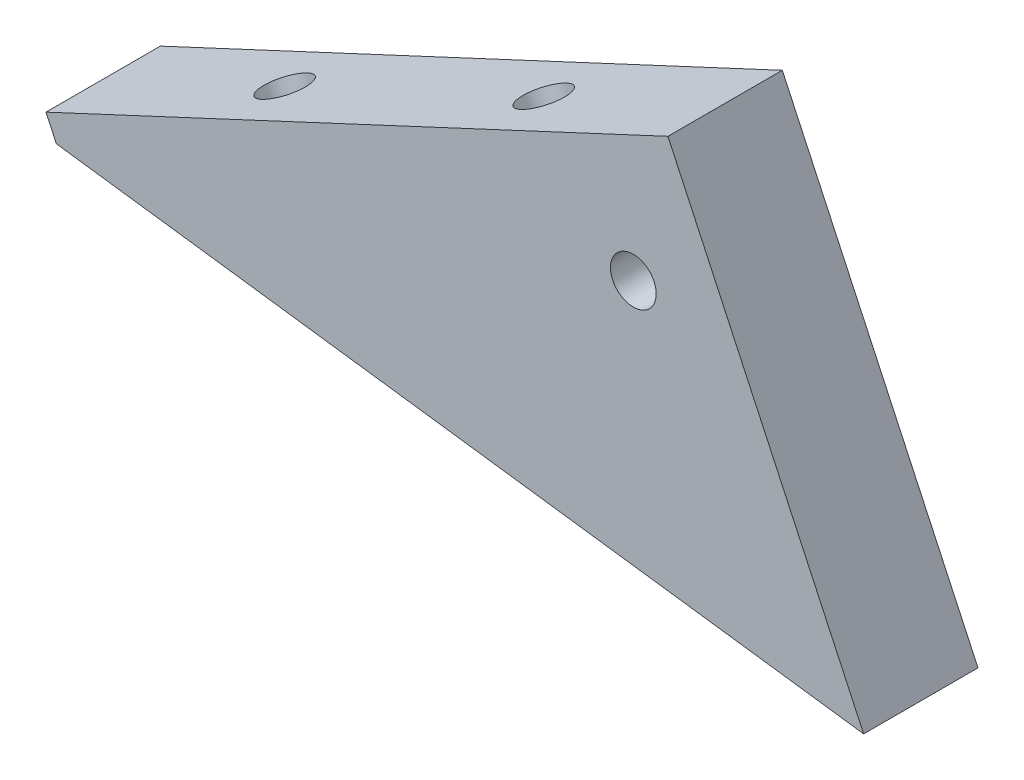
ISO-10303-21;
HEADER;
FILE_DESCRIPTION(('STEP AP214'),'2;1');
FILE_NAME('part.step','',(''),(''),'','','');
FILE_SCHEMA(('AUTOMOTIVE_DESIGN { 1 0 10303 214 1 1 1 1 }'));
ENDSEC;
DATA;
#1=APPLICATION_CONTEXT('core data for automotive mechanical design processes');
#2=APPLICATION_PROTOCOL_DEFINITION('international standard','automotive_design',2000,#1);
#3=PRODUCT_CONTEXT('',#1,'mechanical');
#4=PRODUCT('Part','Part','',(#3));
#5=PRODUCT_RELATED_PRODUCT_CATEGORY('part','',(#4));
#6=PRODUCT_DEFINITION_FORMATION('','',#4);
#7=PRODUCT_DEFINITION_CONTEXT('part definition',#1,'design');
#8=PRODUCT_DEFINITION('design','',#6,#7);
#9=PRODUCT_DEFINITION_SHAPE('','',#8);
#10=(LENGTH_UNIT() NAMED_UNIT(*) SI_UNIT(.MILLI.,.METRE.));
#11=(NAMED_UNIT(*) PLANE_ANGLE_UNIT() SI_UNIT($,.RADIAN.));
#12=(NAMED_UNIT(*) SI_UNIT($,.STERADIAN.) SOLID_ANGLE_UNIT());
#13=UNCERTAINTY_MEASURE_WITH_UNIT(LENGTH_MEASURE(1.E-05),#10,'distance_accuracy_value','');
#14=(GEOMETRIC_REPRESENTATION_CONTEXT(3) GLOBAL_UNCERTAINTY_ASSIGNED_CONTEXT((#13)) GLOBAL_UNIT_ASSIGNED_CONTEXT((#10,
#11,#12)) REPRESENTATION_CONTEXT('',''));
#15=CARTESIAN_POINT('',(0.,0.,0.));
#16=DIRECTION('',(0.,0.,1.));
#17=DIRECTION('',(1.,0.,0.));
#18=AXIS2_PLACEMENT_3D('',#15,#16,#17);
#19=CARTESIAN_POINT('',(0.,0.,-10.));
#20=DIRECTION('',(0.,0.,1.));
#21=DIRECTION('',(1.,0.,0.));
#22=AXIS2_PLACEMENT_3D('',#19,#20,#21);
#23=PLANE('',#22);
#24=DIRECTION('',(0.991258072625589,-0.13193723301101,0.));
#25=VECTOR('',#24,1.);
#26=CARTESIAN_POINT('',(54.6971912005426,1.2869907907734,-10.));
#27=LINE('',#26,#25);
#28=CARTESIAN_POINT('',(54.6971912005426,1.2869907907734,-10.));
#29=VERTEX_POINT('',#28);
#30=CARTESIAN_POINT('',(125.28069637524,-8.1077295410381,-10.));
#31=VERTEX_POINT('',#30);
#32=EDGE_CURVE('E297',#29,#31,#27,.T.);
#33=ORIENTED_EDGE('',*,*,#32,.F.);
#34=DIRECTION('',(0.422618261740695,-0.906307787036652,0.));
#35=VECTOR('',#34,1.);
#36=CARTESIAN_POINT('',(53.7905362644389,3.23131857576186,-10.));
#37=LINE('',#36,#35);
#38=CARTESIAN_POINT('',(53.7905362644389,3.23131857576186,-10.));
#39=VERTEX_POINT('',#38);
#40=EDGE_CURVE('E307',#39,#29,#37,.T.);
#41=ORIENTED_EDGE('',*,*,#40,.F.);
#42=DIRECTION('',(-0.906307787036652,-0.422618261740695,0.));
#43=VECTOR('',#42,1.);
#44=CARTESIAN_POINT('',(108.169003486638,28.5884142802036,-10.));
#45=LINE('',#44,#43);
#46=CARTESIAN_POINT('',(108.169003486638,28.5884142802036,-10.));
#47=VERTEX_POINT('',#46);
#48=EDGE_CURVE('E304',#47,#39,#45,.T.);
#49=ORIENTED_EDGE('',*,*,#48,.F.);
#50=DIRECTION('',(-0.422618261740695,0.906307787036652,0.));
#51=VECTOR('',#50,1.);
#52=CARTESIAN_POINT('',(125.28069637524,-8.1077295410381,-10.));
#53=LINE('',#52,#51);
#54=EDGE_CURVE('E300',#31,#47,#53,.T.);
#55=ORIENTED_EDGE('',*,*,#54,.F.);
#56=EDGE_LOOP('',(#33,#41,#49,#55));
#57=FACE_BOUND('',#56,.T.);
#58=DIRECTION('',(0.573576436351057,0.819152044288984,0.));
#59=VECTOR('',#58,1.);
#60=CARTESIAN_POINT('',(65.8348185887437,-46.0980362525084,-10.));
#61=LINE('',#60,#59);
#62=CARTESIAN_POINT('',(106.852715178015,12.4815910022116,-10.));
#63=VERTEX_POINT('',#62);
#64=CARTESIAN_POINT('',(109.170796747512,15.7921545751541,-10.));
#65=VERTEX_POINT('',#64);
#66=EDGE_CURVE('E50',#63,#65,#61,.T.);
#67=ORIENTED_EDGE('',*,*,#66,.T.);
#68=DIRECTION('',(-0.422618261740693,0.906307787036653,0.));
#69=VECTOR('',#68,1.);
#70=CARTESIAN_POINT('',(95.7209622467967,44.635417741646,-10.));
#71=LINE('',#70,#69);
#72=CARTESIAN_POINT('',(107.462805377249,19.4549538888539,-10.));
#73=VERTEX_POINT('',#72);
#74=EDGE_CURVE('E204',#65,#73,#71,.T.);
#75=ORIENTED_EDGE('',*,*,#74,.T.);
#76=DIRECTION('',(-0.996194698091745,0.087155742747663,0.));
#77=VECTOR('',#76,1.);
#78=CARTESIAN_POINT('',(2.5054593853431,28.6375318169143,-10.));
#79=LINE('',#78,#77);
#80=CARTESIAN_POINT('',(103.436732437489,19.8071896296114,-10.));
#81=VERTEX_POINT('',#80);
#82=EDGE_CURVE('E705',#73,#81,#79,.T.);
#83=ORIENTED_EDGE('',*,*,#82,.T.);
#84=DIRECTION('',(-0.573576436351059,-0.819152044288983,0.));
#85=VECTOR('',#84,1.);
#86=CARTESIAN_POINT('',(60.1007542787206,-42.0830011980511,-10.));
#87=LINE('',#86,#85);
#88=CARTESIAN_POINT('',(101.118650867992,16.496626056669,-10.));
#89=VERTEX_POINT('',#88);
#90=EDGE_CURVE('E702',#81,#89,#87,.T.);
#91=ORIENTED_EDGE('',*,*,#90,.T.);
#92=DIRECTION('',(0.422618261740696,-0.906307787036652,0.));
#93=VECTOR('',#92,1.);
#94=CARTESIAN_POINT('',(89.3768077375398,41.6770899094614,-10.));
#95=LINE('',#94,#93);
#96=CARTESIAN_POINT('',(102.826642238255,12.8338267429691,-10.));
#97=VERTEX_POINT('',#96);
#98=EDGE_CURVE('E696',#89,#97,#95,.T.);
#99=ORIENTED_EDGE('',*,*,#98,.T.);
#100=DIRECTION('',(0.996194698091745,-0.0871557427476624,0.));
#101=VECTOR('',#100,1.);
#102=CARTESIAN_POINT('',(1.89536918610943,21.6641689302719,-10.));
#103=LINE('',#102,#101);
#104=EDGE_CURVE('E200',#97,#63,#103,.T.);
#105=ORIENTED_EDGE('',*,*,#104,.T.);
#106=EDGE_LOOP('',(#67,#75,#83,#91,#99,#105));
#107=FACE_BOUND('',#106,.T.);
#108=ADVANCED_FACE('F35',(#57,#107),#23,.F.);
#109=CARTESIAN_POINT('',(86.7626154261824,-26.0690056650177,-5.));
#110=DIRECTION('',(-0.422618261740695,0.906307787036652,0.));
#111=DIRECTION('',(-0.906307787036652,-0.422618261740695,0.));
#112=AXIS2_PLACEMENT_3D('',#109,#110,#111);
#113=CYLINDRICAL_SURFACE('',#112,2.);
#114=CARTESIAN_POINT('',(69.6509225375803,10.627138156224,-5.));
#115=DIRECTION('',(-0.422618261740695,0.906307787036652,0.));
#116=DIRECTION('',(-0.906307787036652,-0.422618261740695,0.));
#117=AXIS2_PLACEMENT_3D('',#114,#115,#116);
#118=CIRCLE('',#117,2.);
#119=CARTESIAN_POINT('',(67.838306963507,9.78190163274262,-5.));
#120=VERTEX_POINT('',#119);
#121=EDGE_CURVE('E291',#120,#120,#118,.F.);
#122=ORIENTED_EDGE('',*,*,#121,.F.);
#123=EDGE_LOOP('',(#122));
#124=FACE_BOUND('',#123,.T.);
#125=CARTESIAN_POINT('',(71.3413955845431,7.0019070080774,-5.));
#126=DIRECTION('',(-0.422618261740695,0.906307787036652,0.));
#127=DIRECTION('',(0.906307787036652,0.422618261740695,0.));
#128=AXIS2_PLACEMENT_3D('',#125,#126,#127);
#129=CIRCLE('',#128,2.);
#130=CARTESIAN_POINT('',(73.1540111586164,7.84714353155879,-5.));
#131=VERTEX_POINT('',#130);
#132=EDGE_CURVE('E218',#131,#131,#129,.T.);
#133=ORIENTED_EDGE('',*,*,#132,.F.);
#134=EDGE_LOOP('',(#133));
#135=FACE_BOUND('',#134,.T.);
#136=ADVANCED_FACE('F393',(#124,#135),#113,.F.);
#137=CARTESIAN_POINT('',(54.6971912005426,1.2869907907734,-10.));
#138=DIRECTION('',(-0.13193723301101,-0.99125807262559,0.));
#139=DIRECTION('',(0.99125807262559,-0.13193723301101,0.));
#140=AXIS2_PLACEMENT_3D('',#137,#138,#139);
#141=PLANE('',#140);
#142=CARTESIAN_POINT('',(88.067921698468,-3.15467981654927,-5.));
#143=DIRECTION('',(-0.13193723301101,-0.99125807262559,0.));
#144=DIRECTION('',(0.99125807262559,-0.13193723301101,0.));
#145=AXIS2_PLACEMENT_3D('',#142,#143,#144);
#146=CIRCLE('',#145,1.99999999999999);
#147=CARTESIAN_POINT('',(90.0504378437192,-3.41855428257129,-5.));
#148=VERTEX_POINT('',#147);
#149=EDGE_CURVE('E219',#148,#148,#146,.T.);
#150=ORIENTED_EDGE('',*,*,#149,.F.);
#151=EDGE_LOOP('',(#150));
#152=FACE_BOUND('',#151,.T.);
#153=CARTESIAN_POINT('',(113.445454233628,-6.53244945676742,-5.00000000000003));
#154=DIRECTION('',(-0.13193723301101,-0.99125807262559,0.));
#155=DIRECTION('',(0.99125807262559,-0.13193723301101,0.));
#156=AXIS2_PLACEMENT_3D('',#153,#154,#155);
#157=CIRCLE('',#156,2.00000000000001);
#158=CARTESIAN_POINT('',(115.427970378879,-6.79632392278944,-5.00000000000003));
#159=VERTEX_POINT('',#158);
#160=EDGE_CURVE('E209',#159,#159,#157,.T.);
#161=ORIENTED_EDGE('',*,*,#160,.F.);
#162=EDGE_LOOP('',(#161));
#163=FACE_BOUND('',#162,.T.);
#164=DIRECTION('',(-0.891372722084861,0.1186424138992,-0.437468453659456));
#165=VECTOR('',#164,1.);
#166=CARTESIAN_POINT('',(60.7397913097794,0.482715939832673,-22.5303435521819));
#167=LINE('',#166,#165);
#168=CARTESIAN_POINT('',(104.693840699287,-5.36760277759307,-0.958548115672611));
#169=VERTEX_POINT('',#168);
#170=CARTESIAN_POINT('',(100.576469564096,-4.81957742490407,-2.97927405783631));
#171=VERTEX_POINT('',#170);
#172=EDGE_CURVE('E11',#169,#171,#167,.T.);
#173=ORIENTED_EDGE('',*,*,#172,.F.);
#174=DIRECTION('',(-0.891372722084862,0.1186424138992,0.437468453659454));
#175=VECTOR('',#174,1.);
#176=CARTESIAN_POINT('',(67.7911734572246,-0.455828597790024,17.1525656466322));
#177=LINE('',#176,#175);
#178=CARTESIAN_POINT('',(108.811211834477,-5.91562813028208,-2.9792740578363));
#179=VERTEX_POINT('',#178);
#180=EDGE_CURVE('E341',#179,#169,#177,.T.);
#181=ORIENTED_EDGE('',*,*,#180,.F.);
#182=DIRECTION('',(0.,0.,1.));
#183=VECTOR('',#182,1.);
#184=CARTESIAN_POINT('',(108.811211834477,-5.91562813028208,-10.));
#185=LINE('',#184,#183);
#186=CARTESIAN_POINT('',(108.811211834477,-5.91562813028208,-7.02072594216369));
#187=VERTEX_POINT('',#186);
#188=EDGE_CURVE('E343',#187,#179,#185,.T.);
#189=ORIENTED_EDGE('',*,*,#188,.F.);
#190=DIRECTION('',(0.891372722084862,-0.1186424138992,0.437468453659455));
#191=VECTOR('',#190,1.);
#192=CARTESIAN_POINT('',(63.8916989935778,0.0631945356790518,-29.0663521261042));
#193=LINE('',#192,#191);
#194=CARTESIAN_POINT('',(104.693840699287,-5.36760277759308,-9.04145188432737));
#195=VERTEX_POINT('',#194);
#196=EDGE_CURVE('E345',#195,#187,#193,.T.);
#197=ORIENTED_EDGE('',*,*,#196,.F.);
#198=DIRECTION('',(0.891372722084862,-0.1186424138992,-0.437468453659455));
#199=VECTOR('',#198,1.);
#200=CARTESIAN_POINT('',(64.6392657734262,-0.0363071936364046,10.6165570727099));
#201=LINE('',#200,#199);
#202=CARTESIAN_POINT('',(100.576469564096,-4.81957742490406,-7.02072594216368));
#203=VERTEX_POINT('',#202);
#204=EDGE_CURVE('E347',#203,#195,#201,.T.);
#205=ORIENTED_EDGE('',*,*,#204,.F.);
#206=DIRECTION('',(0.,0.,-1.));
#207=VECTOR('',#206,1.);
#208=CARTESIAN_POINT('',(100.576469564096,-4.81957742490407,-10.));
#209=LINE('',#208,#207);
#210=EDGE_CURVE('E43',#171,#203,#209,.T.);
#211=ORIENTED_EDGE('',*,*,#210,.F.);
#212=EDGE_LOOP('',(#173,#181,#189,#197,#205,#211));
#213=FACE_BOUND('',#212,.T.);
#214=DIRECTION('',(0.,0.,1.));
#215=VECTOR('',#214,1.);
#216=CARTESIAN_POINT('',(79.4014180116867,-2.00116132536062,-10.));
#217=LINE('',#216,#215);
#218=CARTESIAN_POINT('',(79.4014180116867,-2.00116132536061,-7.02072594216369));
#219=VERTEX_POINT('',#218);
#220=CARTESIAN_POINT('',(79.4014180116867,-2.00116132536062,-2.97927405783631));
#221=VERTEX_POINT('',#220);
#222=EDGE_CURVE('E339',#219,#221,#217,.T.);
#223=ORIENTED_EDGE('',*,*,#222,.F.);
#224=DIRECTION('',(0.891372722084862,-0.1186424138992,0.437468453659455));
#225=VECTOR('',#224,1.);
#226=CARTESIAN_POINT('',(58.2632924153664,0.812339900239097,-17.3949082441));
#227=LINE('',#226,#225);
#228=CARTESIAN_POINT('',(75.284046876496,-1.45313597267162,-9.04145188432738));
#229=VERTEX_POINT('',#228);
#230=EDGE_CURVE('E323',#229,#219,#227,.T.);
#231=ORIENTED_EDGE('',*,*,#230,.F.);
#232=DIRECTION('',(0.891372722084862,-0.1186424138992,-0.437468453659455));
#233=VECTOR('',#232,1.);
#234=CARTESIAN_POINT('',(59.0108591952148,0.712838170923639,-1.05488680929424));
#235=LINE('',#234,#233);
#236=CARTESIAN_POINT('',(71.1666757413053,-0.905110619982605,-7.02072594216369));
#237=VERTEX_POINT('',#236);
#238=EDGE_CURVE('E330',#237,#229,#235,.T.);
#239=ORIENTED_EDGE('',*,*,#238,.F.);
#240=DIRECTION('',(0.,0.,-1.));
#241=VECTOR('',#240,1.);
#242=CARTESIAN_POINT('',(71.1666757413053,-0.905110619982614,-10.));
#243=LINE('',#242,#241);
#244=CARTESIAN_POINT('',(71.1666757413053,-0.905110619982611,-2.9792740578363));
#245=VERTEX_POINT('',#244);
#246=EDGE_CURVE('E333',#245,#237,#243,.T.);
#247=ORIENTED_EDGE('',*,*,#246,.F.);
#248=DIRECTION('',(-0.891372722084862,0.1186424138992,-0.437468453659454));
#249=VECTOR('',#248,1.);
#250=CARTESIAN_POINT('',(55.111384731568,1.23186130439272,-10.8588996701777));
#251=LINE('',#250,#249);
#252=CARTESIAN_POINT('',(75.284046876496,-1.45313597267161,-0.958548115672612));
#253=VERTEX_POINT('',#252);
#254=EDGE_CURVE('E335',#253,#245,#251,.T.);
#255=ORIENTED_EDGE('',*,*,#254,.F.);
#256=DIRECTION('',(-0.891372722084861,0.1186424138992,0.437468453659456));
#257=VECTOR('',#256,1.);
#258=CARTESIAN_POINT('',(62.1627668790132,0.29331676677001,5.48112176462811));
#259=LINE('',#258,#257);
#260=EDGE_CURVE('E337',#221,#253,#259,.T.);
#261=ORIENTED_EDGE('',*,*,#260,.F.);
#262=EDGE_LOOP('',(#223,#231,#239,#247,#255,#261));
#263=FACE_BOUND('',#262,.T.);
#264=DIRECTION('',(0.991258072625589,-0.13193723301101,0.));
#265=VECTOR('',#264,1.);
#266=CARTESIAN_POINT('',(54.6971912005426,1.2869907907734,0.));
#267=LINE('',#266,#265);
#268=CARTESIAN_POINT('',(54.6971912005426,1.2869907907734,0.));
#269=VERTEX_POINT('',#268);
#270=CARTESIAN_POINT('',(125.28069637524,-8.1077295410381,0.));
#271=VERTEX_POINT('',#270);
#272=EDGE_CURVE('E294',#269,#271,#267,.T.);
#273=ORIENTED_EDGE('',*,*,#272,.F.);
#274=DIRECTION('',(0.,0.,1.));
#275=VECTOR('',#274,1.);
#276=CARTESIAN_POINT('',(54.6971912005426,1.2869907907734,-10.));
#277=LINE('',#276,#275);
#278=EDGE_CURVE('E321',#29,#269,#277,.T.);
#279=ORIENTED_EDGE('',*,*,#278,.F.);
#280=ORIENTED_EDGE('',*,*,#32,.T.);
#281=DIRECTION('',(0.,0.,1.));
#282=VECTOR('',#281,1.);
#283=CARTESIAN_POINT('',(125.28069637524,-8.1077295410381,-10.));
#284=LINE('',#283,#282);
#285=EDGE_CURVE('E310',#31,#271,#284,.T.);
#286=ORIENTED_EDGE('',*,*,#285,.T.);
#287=EDGE_LOOP('',(#273,#279,#280,#286));
#288=FACE_BOUND('',#287,.T.);
#289=ADVANCED_FACE('F37',(#152,#163,#213,#263,#288),#141,.T.);
#290=CARTESIAN_POINT('',(108.169003486638,28.5884142802036,-10.));
#291=DIRECTION('',(-0.422618261740695,0.906307787036652,0.));
#292=DIRECTION('',(-0.906307787036652,-0.422618261740695,0.));
#293=AXIS2_PLACEMENT_3D('',#290,#291,#292);
#294=PLANE('',#293);
#295=DIRECTION('',(-0.906307787036652,-0.422618261740695,0.));
#296=VECTOR('',#295,1.);
#297=CARTESIAN_POINT('',(108.169003486638,28.5884142802036,0.));
#298=LINE('',#297,#296);
#299=CARTESIAN_POINT('',(108.169003486638,28.5884142802036,0.));
#300=VERTEX_POINT('',#299);
#301=CARTESIAN_POINT('',(53.7905362644389,3.23131857576186,0.));
#302=VERTEX_POINT('',#301);
#303=EDGE_CURVE('E316',#300,#302,#298,.T.);
#304=ORIENTED_EDGE('',*,*,#303,.F.);
#305=DIRECTION('',(0.,0.,1.));
#306=VECTOR('',#305,1.);
#307=CARTESIAN_POINT('',(108.169003486638,28.5884142802036,-10.));
#308=LINE('',#307,#306);
#309=EDGE_CURVE('E326',#47,#300,#308,.T.);
#310=ORIENTED_EDGE('',*,*,#309,.F.);
#311=ORIENTED_EDGE('',*,*,#48,.T.);
#312=DIRECTION('',(0.,0.,1.));
#313=VECTOR('',#312,1.);
#314=CARTESIAN_POINT('',(53.7905362644389,3.23131857576186,-10.));
#315=LINE('',#314,#313);
#316=EDGE_CURVE('E324',#39,#302,#315,.T.);
#317=ORIENTED_EDGE('',*,*,#316,.T.);
#318=EDGE_LOOP('',(#304,#310,#311,#317));
#319=FACE_BOUND('',#318,.T.);
#320=CARTESIAN_POINT('',(92.3086172134966,21.1925946997414,-5.));
#321=DIRECTION('',(-0.422618261740695,0.906307787036652,0.));
#322=DIRECTION('',(-0.906307787036652,-0.422618261740695,0.));
#323=AXIS2_PLACEMENT_3D('',#320,#321,#322);
#324=CIRCLE('',#323,1.99999999999997);
#325=CARTESIAN_POINT('',(90.4960016394234,20.34735817626,-5.));
#326=VERTEX_POINT('',#325);
#327=EDGE_CURVE('E251',#326,#326,#324,.T.);
#328=ORIENTED_EDGE('',*,*,#327,.F.);
#329=EDGE_LOOP('',(#328));
#330=FACE_BOUND('',#329,.T.);
#331=ORIENTED_EDGE('',*,*,#121,.T.);
#332=EDGE_LOOP('',(#331));
#333=FACE_BOUND('',#332,.T.);
#334=ADVANCED_FACE('F414',(#319,#330,#333),#294,.T.);
#335=CARTESIAN_POINT('',(53.7905362644389,3.23131857576186,-10.));
#336=DIRECTION('',(-0.906307787036652,-0.422618261740695,0.));
#337=DIRECTION('',(0.422618261740695,-0.906307787036652,0.));
#338=AXIS2_PLACEMENT_3D('',#335,#336,#337);
#339=PLANE('',#338);
#340=DIRECTION('',(0.422618261740695,-0.906307787036652,0.));
#341=VECTOR('',#340,1.);
#342=CARTESIAN_POINT('',(53.7905362644389,3.23131857576186,0.));
#343=LINE('',#342,#341);
#344=EDGE_CURVE('E301',#302,#269,#343,.T.);
#345=ORIENTED_EDGE('',*,*,#344,.F.);
#346=ORIENTED_EDGE('',*,*,#316,.F.);
#347=ORIENTED_EDGE('',*,*,#40,.T.);
#348=ORIENTED_EDGE('',*,*,#278,.T.);
#349=EDGE_LOOP('',(#345,#346,#347,#348));
#350=FACE_BOUND('',#349,.T.);
#351=ADVANCED_FACE('F411',(#350),#339,.T.);
#352=CARTESIAN_POINT('',(125.28069637524,-8.1077295410381,-10.));
#353=DIRECTION('',(0.906307787036652,0.422618261740695,0.));
#354=DIRECTION('',(-0.422618261740695,0.906307787036652,0.));
#355=AXIS2_PLACEMENT_3D('',#352,#353,#354);
#356=PLANE('',#355);
#357=DIRECTION('',(-0.422618261740695,0.906307787036652,0.));
#358=VECTOR('',#357,1.);
#359=CARTESIAN_POINT('',(125.28069637524,-8.1077295410381,0.));
#360=LINE('',#359,#358);
#361=EDGE_CURVE('E313',#271,#300,#360,.T.);
#362=ORIENTED_EDGE('',*,*,#361,.F.);
#363=ORIENTED_EDGE('',*,*,#285,.F.);
#364=ORIENTED_EDGE('',*,*,#54,.T.);
#365=ORIENTED_EDGE('',*,*,#309,.T.);
#366=EDGE_LOOP('',(#362,#363,#364,#365));
#367=FACE_BOUND('',#366,.T.);
#368=ADVANCED_FACE('F409',(#367),#356,.T.);
#369=CARTESIAN_POINT('',(0.,0.,0.));
#370=DIRECTION('',(0.,0.,1.));
#371=DIRECTION('',(1.,0.,0.));
#372=AXIS2_PLACEMENT_3D('',#369,#370,#371);
#373=PLANE('',#372);
#374=CARTESIAN_POINT('',(105.144723807752,16.1443903159115,0.));
#375=DIRECTION('',(0.,0.,1.));
#376=DIRECTION('',(1.,0.,0.));
#377=AXIS2_PLACEMENT_3D('',#374,#375,#376);
#378=CIRCLE('',#377,2.);
#379=CARTESIAN_POINT('',(107.144723807752,16.1443903159115,0.));
#380=VERTEX_POINT('',#379);
#381=EDGE_CURVE('E205',#380,#380,#378,.T.);
#382=ORIENTED_EDGE('',*,*,#381,.F.);
#383=EDGE_LOOP('',(#382));
#384=FACE_BOUND('',#383,.T.);
#385=ORIENTED_EDGE('',*,*,#272,.T.);
#386=ORIENTED_EDGE('',*,*,#361,.T.);
#387=ORIENTED_EDGE('',*,*,#303,.T.);
#388=ORIENTED_EDGE('',*,*,#344,.T.);
#389=EDGE_LOOP('',(#385,#386,#387,#388));
#390=FACE_BOUND('',#389,.T.);
#391=ADVANCED_FACE('F406',(#384,#390),#373,.T.);
#392=CARTESIAN_POINT('',(109.420310102099,-15.5035491215003,-5.));
#393=DIRECTION('',(-0.422618261740695,0.906307787036652,0.));
#394=DIRECTION('',(-0.906307787036652,-0.422618261740695,0.));
#395=AXIS2_PLACEMENT_3D('',#392,#393,#394);
#396=CYLINDRICAL_SURFACE('',#395,1.99999999999997);
#397=CARTESIAN_POINT('',(93.9990902604594,17.5673635515948,-5.));
#398=DIRECTION('',(-0.422618261740695,0.906307787036652,0.));
#399=DIRECTION('',(-0.906307787036652,-0.422618261740695,0.));
#400=AXIS2_PLACEMENT_3D('',#397,#398,#399);
#401=CIRCLE('',#400,1.99999999999997);
#402=CARTESIAN_POINT('',(92.1864746863861,16.7221270281134,-5.));
#403=VERTEX_POINT('',#402);
#404=EDGE_CURVE('E227',#403,#403,#401,.T.);
#405=ORIENTED_EDGE('',*,*,#404,.F.);
#406=EDGE_LOOP('',(#405));
#407=FACE_BOUND('',#406,.T.);
#408=ORIENTED_EDGE('',*,*,#327,.T.);
#409=EDGE_LOOP('',(#408));
#410=FACE_BOUND('',#409,.T.);
#411=ADVANCED_FACE('F405',(#407,#410),#396,.F.);
#412=CARTESIAN_POINT('',(89.9346926808106,-24.5898417489252,-7.02072594216369));
#413=DIRECTION('',(0.906307787036652,0.422618261740695,0.));
#414=DIRECTION('',(-0.422618261740695,0.906307787036652,0.));
#415=AXIS2_PLACEMENT_3D('',#412,#413,#414);
#416=PLANE('',#415);
#417=ORIENTED_EDGE('',*,*,#222,.T.);
#418=DIRECTION('',(-0.422618261740695,0.906307787036652,0.));
#419=VECTOR('',#418,1.);
#420=CARTESIAN_POINT('',(89.9346926808106,-24.5898417489252,-2.97927405783631));
#421=LINE('',#420,#419);
#422=CARTESIAN_POINT('',(74.5134728391714,8.48107092416983,-2.97927405783631));
#423=VERTEX_POINT('',#422);
#424=EDGE_CURVE('E231',#221,#423,#421,.T.);
#425=ORIENTED_EDGE('',*,*,#424,.T.);
#426=DIRECTION('',(0.,0.,-1.));
#427=VECTOR('',#426,1.);
#428=CARTESIAN_POINT('',(74.5134728391714,8.48107092416983,-7.02072594216369));
#429=LINE('',#428,#427);
#430=CARTESIAN_POINT('',(74.5134728391714,8.48107092416983,-7.02072594216369));
#431=VERTEX_POINT('',#430);
#432=EDGE_CURVE('E262',#423,#431,#429,.T.);
#433=ORIENTED_EDGE('',*,*,#432,.T.);
#434=DIRECTION('',(-0.422618261740695,0.906307787036652,0.));
#435=VECTOR('',#434,1.);
#436=CARTESIAN_POINT('',(89.9346926808106,-24.5898417489252,-7.02072594216369));
#437=LINE('',#436,#435);
#438=EDGE_CURVE('E280',#219,#431,#437,.T.);
#439=ORIENTED_EDGE('',*,*,#438,.F.);
#440=EDGE_LOOP('',(#417,#425,#433,#439));
#441=FACE_BOUND('',#440,.T.);
#442=ADVANCED_FACE('F465',(#441),#416,.F.);
#443=CARTESIAN_POINT('',(89.9346926808106,-24.5898417489252,-2.97927405783631));
#444=DIRECTION('',(0.453153893518327,0.211309130870348,0.866025403784438));
#445=DIRECTION('',(0.886032658107769,0.,-0.463622830290401));
#446=AXIS2_PLACEMENT_3D('',#443,#444,#445);
#447=PLANE('',#446);
#448=ORIENTED_EDGE('',*,*,#260,.T.);
#449=DIRECTION('',(-0.422618261740695,0.906307787036652,0.));
#450=VECTOR('',#449,1.);
#451=CARTESIAN_POINT('',(86.7626154261824,-26.0690056650177,-0.958548115672611));
#452=LINE('',#451,#450);
#453=CARTESIAN_POINT('',(71.3413955845431,7.0019070080774,-0.958548115672611));
#454=VERTEX_POINT('',#453);
#455=EDGE_CURVE('E282',#253,#454,#452,.T.);
#456=ORIENTED_EDGE('',*,*,#455,.T.);
#457=DIRECTION('',(0.784885567221397,0.365998150770662,-0.500000000000001));
#458=VECTOR('',#457,1.);
#459=CARTESIAN_POINT('',(74.5134728391714,8.48107092416983,-2.97927405783631));
#460=LINE('',#459,#458);
#461=EDGE_CURVE('E277',#454,#423,#460,.T.);
#462=ORIENTED_EDGE('',*,*,#461,.T.);
#463=ORIENTED_EDGE('',*,*,#424,.F.);
#464=EDGE_LOOP('',(#448,#456,#462,#463));
#465=FACE_BOUND('',#464,.T.);
#466=ADVANCED_FACE('F447',(#465),#447,.F.);
#467=CARTESIAN_POINT('',(86.7626154261824,-26.0690056650177,-0.958548115672611));
#468=DIRECTION('',(-0.453153893518325,-0.211309130870347,0.866025403784439));
#469=DIRECTION('',(0.88603265810777,0.,0.463622830290398));
#470=AXIS2_PLACEMENT_3D('',#467,#468,#469);
#471=PLANE('',#470);
#472=ORIENTED_EDGE('',*,*,#254,.T.);
#473=DIRECTION('',(-0.422618261740695,0.906307787036652,0.));
#474=VECTOR('',#473,1.);
#475=CARTESIAN_POINT('',(83.5905381715541,-27.5481695811101,-2.9792740578363));
#476=LINE('',#475,#474);
#477=CARTESIAN_POINT('',(68.1693183299148,5.52274309198497,-2.9792740578363));
#478=VERTEX_POINT('',#477);
#479=EDGE_CURVE('E284',#245,#478,#476,.T.);
#480=ORIENTED_EDGE('',*,*,#479,.T.);
#481=DIRECTION('',(0.784885567221398,0.365998150770663,0.499999999999999));
#482=VECTOR('',#481,1.);
#483=CARTESIAN_POINT('',(71.3413955845431,7.0019070080774,-0.958548115672611));
#484=LINE('',#483,#482);
#485=EDGE_CURVE('E274',#478,#454,#484,.T.);
#486=ORIENTED_EDGE('',*,*,#485,.T.);
#487=ORIENTED_EDGE('',*,*,#455,.F.);
#488=EDGE_LOOP('',(#472,#480,#486,#487));
#489=FACE_BOUND('',#488,.T.);
#490=ADVANCED_FACE('F452',(#489),#471,.F.);
#491=CARTESIAN_POINT('',(83.5905381715541,-27.5481695811101,-2.9792740578363));
#492=DIRECTION('',(-0.906307787036652,-0.422618261740695,0.));
#493=DIRECTION('',(0.422618261740695,-0.906307787036652,0.));
#494=AXIS2_PLACEMENT_3D('',#491,#492,#493);
#495=PLANE('',#494);
#496=ORIENTED_EDGE('',*,*,#246,.T.);
#497=DIRECTION('',(-0.422618261740695,0.906307787036652,0.));
#498=VECTOR('',#497,1.);
#499=CARTESIAN_POINT('',(83.5905381715541,-27.5481695811101,-7.02072594216369));
#500=LINE('',#499,#498);
#501=CARTESIAN_POINT('',(68.1693183299148,5.52274309198497,-7.02072594216369));
#502=VERTEX_POINT('',#501);
#503=EDGE_CURVE('E286',#237,#502,#500,.T.);
#504=ORIENTED_EDGE('',*,*,#503,.T.);
#505=DIRECTION('',(0.,0.,1.));
#506=VECTOR('',#505,1.);
#507=CARTESIAN_POINT('',(68.1693183299148,5.52274309198497,-2.9792740578363));
#508=LINE('',#507,#506);
#509=EDGE_CURVE('E271',#502,#478,#508,.T.);
#510=ORIENTED_EDGE('',*,*,#509,.T.);
#511=ORIENTED_EDGE('',*,*,#479,.F.);
#512=EDGE_LOOP('',(#496,#504,#510,#511));
#513=FACE_BOUND('',#512,.T.);
#514=ADVANCED_FACE('F456',(#513),#495,.F.);
#515=CARTESIAN_POINT('',(83.5905381715541,-27.5481695811101,-7.02072594216369));
#516=DIRECTION('',(-0.453153893518326,-0.211309130870348,-0.866025403784439));
#517=DIRECTION('',(-0.88603265810777,0.,0.463622830290399));
#518=AXIS2_PLACEMENT_3D('',#515,#516,#517);
#519=PLANE('',#518);
#520=ORIENTED_EDGE('',*,*,#238,.T.);
#521=DIRECTION('',(-0.422618261740695,0.906307787036652,0.));
#522=VECTOR('',#521,1.);
#523=CARTESIAN_POINT('',(86.7626154261824,-26.0690056650177,-9.04145188432738));
#524=LINE('',#523,#522);
#525=CARTESIAN_POINT('',(71.3413955845431,7.0019070080774,-9.04145188432738));
#526=VERTEX_POINT('',#525);
#527=EDGE_CURVE('E288',#229,#526,#524,.T.);
#528=ORIENTED_EDGE('',*,*,#527,.T.);
#529=DIRECTION('',(-0.784885567221398,-0.365998150770663,0.5));
#530=VECTOR('',#529,1.);
#531=CARTESIAN_POINT('',(68.1693183299148,5.52274309198497,-7.02072594216369));
#532=LINE('',#531,#530);
#533=EDGE_CURVE('E268',#526,#502,#532,.T.);
#534=ORIENTED_EDGE('',*,*,#533,.T.);
#535=ORIENTED_EDGE('',*,*,#503,.F.);
#536=EDGE_LOOP('',(#520,#528,#534,#535));
#537=FACE_BOUND('',#536,.T.);
#538=ADVANCED_FACE('F461',(#537),#519,.F.);
#539=CARTESIAN_POINT('',(86.7626154261824,-26.0690056650177,-9.04145188432738));
#540=DIRECTION('',(0.453153893518326,0.211309130870348,-0.866025403784439));
#541=DIRECTION('',(-0.88603265810777,0.,-0.463622830290399));
#542=AXIS2_PLACEMENT_3D('',#539,#540,#541);
#543=PLANE('',#542);
#544=ORIENTED_EDGE('',*,*,#230,.T.);
#545=ORIENTED_EDGE('',*,*,#438,.T.);
#546=DIRECTION('',(-0.784885567221398,-0.365998150770663,-0.5));
#547=VECTOR('',#546,1.);
#548=CARTESIAN_POINT('',(71.3413955845431,7.0019070080774,-9.04145188432738));
#549=LINE('',#548,#547);
#550=EDGE_CURVE('E265',#431,#526,#549,.T.);
#551=ORIENTED_EDGE('',*,*,#550,.T.);
#552=ORIENTED_EDGE('',*,*,#527,.F.);
#553=EDGE_LOOP('',(#544,#545,#551,#552));
#554=FACE_BOUND('',#553,.T.);
#555=ADVANCED_FACE('F388',(#554),#543,.F.);
#556=CARTESIAN_POINT('',(10.0601292451394,-21.5740167874223,0.));
#557=DIRECTION('',(0.422618261740695,-0.906307787036652,0.));
#558=DIRECTION('',(0.906307787036652,0.422618261740695,0.));
#559=AXIS2_PLACEMENT_3D('',#556,#557,#558);
#560=PLANE('',#559);
#561=ORIENTED_EDGE('',*,*,#132,.T.);
#562=EDGE_LOOP('',(#561));
#563=FACE_BOUND('',#562,.T.);
#564=ORIENTED_EDGE('',*,*,#432,.F.);
#565=ORIENTED_EDGE('',*,*,#461,.F.);
#566=ORIENTED_EDGE('',*,*,#485,.F.);
#567=ORIENTED_EDGE('',*,*,#509,.F.);
#568=ORIENTED_EDGE('',*,*,#533,.F.);
#569=ORIENTED_EDGE('',*,*,#550,.F.);
#570=EDGE_LOOP('',(#564,#565,#566,#567,#568,#569));
#571=FACE_BOUND('',#570,.T.);
#572=ADVANCED_FACE('F381',(#563,#571),#560,.T.);
#573=CARTESIAN_POINT('',(106.24823284747,-16.9827130375927,-2.97927405783631));
#574=DIRECTION('',(-0.453153893518327,-0.211309130870348,0.866025403784438));
#575=DIRECTION('',(0.886032658107769,0.,0.463622830290401));
#576=AXIS2_PLACEMENT_3D('',#573,#574,#575);
#577=PLANE('',#576);
#578=ORIENTED_EDGE('',*,*,#172,.T.);
#579=DIRECTION('',(-0.422618261740695,0.906307787036652,0.));
#580=VECTOR('',#579,1.);
#581=CARTESIAN_POINT('',(106.24823284747,-16.9827130375927,-2.97927405783631));
#582=LINE('',#581,#580);
#583=CARTESIAN_POINT('',(90.8270130058311,16.0881996355023,-2.97927405783631));
#584=VERTEX_POINT('',#583);
#585=EDGE_CURVE('E249',#171,#584,#582,.T.);
#586=ORIENTED_EDGE('',*,*,#585,.T.);
#587=DIRECTION('',(0.784885567221397,0.365998150770663,0.500000000000001));
#588=VECTOR('',#587,1.);
#589=CARTESIAN_POINT('',(90.8270130058311,16.0881996355023,-2.97927405783631));
#590=LINE('',#589,#588);
#591=CARTESIAN_POINT('',(93.9990902604594,17.5673635515948,-0.958548115672611));
#592=VERTEX_POINT('',#591);
#593=EDGE_CURVE('E230',#584,#592,#590,.T.);
#594=ORIENTED_EDGE('',*,*,#593,.T.);
#595=DIRECTION('',(-0.422618261740695,0.906307787036652,0.));
#596=VECTOR('',#595,1.);
#597=CARTESIAN_POINT('',(109.420310102099,-15.5035491215003,-0.958548115672611));
#598=LINE('',#597,#596);
#599=EDGE_CURVE('E248',#169,#592,#598,.T.);
#600=ORIENTED_EDGE('',*,*,#599,.F.);
#601=EDGE_LOOP('',(#578,#586,#594,#600));
#602=FACE_BOUND('',#601,.T.);
#603=ADVANCED_FACE('F379',(#602),#577,.F.);
#604=CARTESIAN_POINT('',(106.24823284747,-16.9827130375927,-7.02072594216369));
#605=DIRECTION('',(-0.906307787036652,-0.422618261740695,0.));
#606=DIRECTION('',(0.422618261740695,-0.906307787036652,0.));
#607=AXIS2_PLACEMENT_3D('',#604,#605,#606);
#608=PLANE('',#607);
#609=ORIENTED_EDGE('',*,*,#210,.T.);
#610=DIRECTION('',(-0.422618261740695,0.906307787036652,0.));
#611=VECTOR('',#610,1.);
#612=CARTESIAN_POINT('',(106.24823284747,-16.9827130375927,-7.02072594216369));
#613=LINE('',#612,#611);
#614=CARTESIAN_POINT('',(90.8270130058311,16.0881996355023,-7.02072594216369));
#615=VERTEX_POINT('',#614);
#616=EDGE_CURVE('E252',#203,#615,#613,.T.);
#617=ORIENTED_EDGE('',*,*,#616,.T.);
#618=DIRECTION('',(0.,0.,1.));
#619=VECTOR('',#618,1.);
#620=CARTESIAN_POINT('',(90.8270130058311,16.0881996355023,-7.02072594216369));
#621=LINE('',#620,#619);
#622=EDGE_CURVE('E245',#615,#584,#621,.T.);
#623=ORIENTED_EDGE('',*,*,#622,.T.);
#624=ORIENTED_EDGE('',*,*,#585,.F.);
#625=EDGE_LOOP('',(#609,#617,#623,#624));
#626=FACE_BOUND('',#625,.T.);
#627=ADVANCED_FACE('F352',(#626),#608,.F.);
#628=CARTESIAN_POINT('',(109.420310102099,-15.5035491215003,-9.04145188432738));
#629=DIRECTION('',(-0.453153893518326,-0.211309130870348,-0.866025403784439));
#630=DIRECTION('',(-0.88603265810777,0.,0.463622830290399));
#631=AXIS2_PLACEMENT_3D('',#628,#629,#630);
#632=PLANE('',#631);
#633=ORIENTED_EDGE('',*,*,#204,.T.);
#634=DIRECTION('',(-0.422618261740695,0.906307787036652,0.));
#635=VECTOR('',#634,1.);
#636=CARTESIAN_POINT('',(109.420310102099,-15.5035491215003,-9.04145188432738));
#637=LINE('',#636,#635);
#638=CARTESIAN_POINT('',(93.9990902604594,17.5673635515948,-9.04145188432738));
#639=VERTEX_POINT('',#638);
#640=EDGE_CURVE('E254',#195,#639,#637,.T.);
#641=ORIENTED_EDGE('',*,*,#640,.T.);
#642=DIRECTION('',(-0.784885567221398,-0.365998150770663,0.5));
#643=VECTOR('',#642,1.);
#644=CARTESIAN_POINT('',(93.9990902604594,17.5673635515948,-9.04145188432738));
#645=LINE('',#644,#643);
#646=EDGE_CURVE('E242',#639,#615,#645,.T.);
#647=ORIENTED_EDGE('',*,*,#646,.T.);
#648=ORIENTED_EDGE('',*,*,#616,.F.);
#649=EDGE_LOOP('',(#633,#641,#647,#648));
#650=FACE_BOUND('',#649,.T.);
#651=ADVANCED_FACE('F357',(#650),#632,.F.);
#652=CARTESIAN_POINT('',(112.592387356727,-14.0243852054078,-7.02072594216369));
#653=DIRECTION('',(0.453153893518326,0.211309130870348,-0.866025403784439));
#654=DIRECTION('',(-0.886032658107769,0.,-0.463622830290399));
#655=AXIS2_PLACEMENT_3D('',#652,#653,#654);
#656=PLANE('',#655);
#657=ORIENTED_EDGE('',*,*,#196,.T.);
#658=DIRECTION('',(-0.422618261740695,0.906307787036652,0.));
#659=VECTOR('',#658,1.);
#660=CARTESIAN_POINT('',(112.592387356727,-14.0243852054078,-7.02072594216369));
#661=LINE('',#660,#659);
#662=CARTESIAN_POINT('',(97.1711675150877,19.0465274676872,-7.02072594216369));
#663=VERTEX_POINT('',#662);
#664=EDGE_CURVE('E256',#187,#663,#661,.T.);
#665=ORIENTED_EDGE('',*,*,#664,.T.);
#666=DIRECTION('',(-0.784885567221398,-0.365998150770662,-0.5));
#667=VECTOR('',#666,1.);
#668=CARTESIAN_POINT('',(97.1711675150877,19.0465274676872,-7.02072594216369));
#669=LINE('',#668,#667);
#670=EDGE_CURVE('E239',#663,#639,#669,.T.);
#671=ORIENTED_EDGE('',*,*,#670,.T.);
#672=ORIENTED_EDGE('',*,*,#640,.F.);
#673=EDGE_LOOP('',(#657,#665,#671,#672));
#674=FACE_BOUND('',#673,.T.);
#675=ADVANCED_FACE('F367',(#674),#656,.F.);
#676=CARTESIAN_POINT('',(112.592387356727,-14.0243852054078,-2.9792740578363));
#677=DIRECTION('',(0.906307787036652,0.422618261740695,0.));
#678=DIRECTION('',(-0.422618261740695,0.906307787036652,0.));
#679=AXIS2_PLACEMENT_3D('',#676,#677,#678);
#680=PLANE('',#679);
#681=ORIENTED_EDGE('',*,*,#188,.T.);
#682=DIRECTION('',(-0.422618261740695,0.906307787036652,0.));
#683=VECTOR('',#682,1.);
#684=CARTESIAN_POINT('',(112.592387356727,-14.0243852054078,-2.9792740578363));
#685=LINE('',#684,#683);
#686=CARTESIAN_POINT('',(97.1711675150877,19.0465274676872,-2.9792740578363));
#687=VERTEX_POINT('',#686);
#688=EDGE_CURVE('E58',#179,#687,#685,.T.);
#689=ORIENTED_EDGE('',*,*,#688,.T.);
#690=DIRECTION('',(0.,0.,-1.));
#691=VECTOR('',#690,1.);
#692=CARTESIAN_POINT('',(97.1711675150877,19.0465274676872,-2.9792740578363));
#693=LINE('',#692,#691);
#694=EDGE_CURVE('E236',#687,#663,#693,.T.);
#695=ORIENTED_EDGE('',*,*,#694,.T.);
#696=ORIENTED_EDGE('',*,*,#664,.F.);
#697=EDGE_LOOP('',(#681,#689,#695,#696));
#698=FACE_BOUND('',#697,.T.);
#699=ADVANCED_FACE('F370',(#698),#680,.F.);
#700=CARTESIAN_POINT('',(109.420310102099,-15.5035491215003,-0.958548115672611));
#701=DIRECTION('',(0.453153893518325,0.211309130870347,0.866025403784439));
#702=DIRECTION('',(0.88603265810777,0.,-0.463622830290398));
#703=AXIS2_PLACEMENT_3D('',#700,#701,#702);
#704=PLANE('',#703);
#705=ORIENTED_EDGE('',*,*,#180,.T.);
#706=ORIENTED_EDGE('',*,*,#599,.T.);
#707=DIRECTION('',(0.784885567221399,0.365998150770662,-0.499999999999999));
#708=VECTOR('',#707,1.);
#709=CARTESIAN_POINT('',(93.9990902604594,17.5673635515948,-0.958548115672611));
#710=LINE('',#709,#708);
#711=EDGE_CURVE('E234',#592,#687,#710,.T.);
#712=ORIENTED_EDGE('',*,*,#711,.T.);
#713=ORIENTED_EDGE('',*,*,#688,.F.);
#714=EDGE_LOOP('',(#705,#706,#712,#713));
#715=FACE_BOUND('',#714,.T.);
#716=ADVANCED_FACE('F376',(#715),#704,.F.);
#717=CARTESIAN_POINT('',(10.0601292451394,-21.5740167874223,0.));
#718=DIRECTION('',(-0.422618261740695,0.906307787036652,0.));
#719=DIRECTION('',(-0.906307787036652,-0.422618261740695,0.));
#720=AXIS2_PLACEMENT_3D('',#717,#718,#719);
#721=PLANE('',#720);
#722=ORIENTED_EDGE('',*,*,#404,.T.);
#723=EDGE_LOOP('',(#722));
#724=FACE_BOUND('',#723,.T.);
#725=ORIENTED_EDGE('',*,*,#593,.F.);
#726=ORIENTED_EDGE('',*,*,#622,.F.);
#727=ORIENTED_EDGE('',*,*,#646,.F.);
#728=ORIENTED_EDGE('',*,*,#670,.F.);
#729=ORIENTED_EDGE('',*,*,#694,.F.);
#730=ORIENTED_EDGE('',*,*,#711,.F.);
#731=EDGE_LOOP('',(#725,#726,#727,#728,#729,#730));
#732=FACE_BOUND('',#731,.T.);
#733=ADVANCED_FACE('F375',(#724,#732),#721,.F.);
#734=CARTESIAN_POINT('',(114.764826563738,3.38013126948848,-5.00000000000003));
#735=DIRECTION('',(-0.13193723301101,-0.99125807262559,0.));
#736=DIRECTION('',(0.99125807262559,-0.13193723301101,0.));
#737=AXIS2_PLACEMENT_3D('',#734,#735,#736);
#738=CYLINDRICAL_SURFACE('',#737,2.00000000000001);
#739=CARTESIAN_POINT('',(114.764826563738,3.38013126948848,-5.00000000000003));
#740=DIRECTION('',(-0.13193723301101,-0.99125807262559,0.));
#741=DIRECTION('',(0.99125807262559,-0.13193723301101,0.));
#742=AXIS2_PLACEMENT_3D('',#739,#740,#741);
#743=CIRCLE('',#742,2.00000000000001);
#744=CARTESIAN_POINT('',(116.747342708989,3.11625680346646,-5.00000000000003));
#745=VERTEX_POINT('',#744);
#746=EDGE_CURVE('E222',#745,#745,#743,.T.);
#747=ORIENTED_EDGE('',*,*,#746,.F.);
#748=EDGE_LOOP('',(#747));
#749=FACE_BOUND('',#748,.T.);
#750=ORIENTED_EDGE('',*,*,#160,.T.);
#751=EDGE_LOOP('',(#750));
#752=FACE_BOUND('',#751,.T.);
#753=ADVANCED_FACE('F552',(#749,#752),#738,.F.);
#754=CARTESIAN_POINT('',(114.764826563738,3.38013126948848,-5.00000000000003));
#755=DIRECTION('',(-0.13193723301101,-0.99125807262559,0.));
#756=DIRECTION('',(0.99125807262559,-0.13193723301101,0.));
#757=AXIS2_PLACEMENT_3D('',#754,#755,#756);
#758=PLANE('',#757);
#759=ORIENTED_EDGE('',*,*,#746,.T.);
#760=EDGE_LOOP('',(#759));
#761=FACE_BOUND('',#760,.T.);
#762=ADVANCED_FACE('F572',(#761),#758,.T.);
#763=CARTESIAN_POINT('',(89.3872940285781,6.75790090970662,-5.));
#764=DIRECTION('',(-0.13193723301101,-0.99125807262559,0.));
#765=DIRECTION('',(0.99125807262559,-0.13193723301101,0.));
#766=AXIS2_PLACEMENT_3D('',#763,#764,#765);
#767=CYLINDRICAL_SURFACE('',#766,1.99999999999999);
#768=CARTESIAN_POINT('',(89.3872940285781,6.75790090970662,-5.));
#769=DIRECTION('',(-0.13193723301101,-0.99125807262559,0.));
#770=DIRECTION('',(0.99125807262559,-0.13193723301101,0.));
#771=AXIS2_PLACEMENT_3D('',#768,#769,#770);
#772=CIRCLE('',#771,1.99999999999999);
#773=CARTESIAN_POINT('',(91.3698101738293,6.49402644368461,-5.));
#774=VERTEX_POINT('',#773);
#775=EDGE_CURVE('E215',#774,#774,#772,.T.);
#776=ORIENTED_EDGE('',*,*,#775,.F.);
#777=EDGE_LOOP('',(#776));
#778=FACE_BOUND('',#777,.T.);
#779=ORIENTED_EDGE('',*,*,#149,.T.);
#780=EDGE_LOOP('',(#779));
#781=FACE_BOUND('',#780,.T.);
#782=ADVANCED_FACE('F582',(#778,#781),#767,.F.);
#783=CARTESIAN_POINT('',(89.3872940285781,6.75790090970662,-5.));
#784=DIRECTION('',(-0.13193723301101,-0.99125807262559,0.));
#785=DIRECTION('',(0.99125807262559,-0.13193723301101,0.));
#786=AXIS2_PLACEMENT_3D('',#783,#784,#785);
#787=PLANE('',#786);
#788=ORIENTED_EDGE('',*,*,#775,.T.);
#789=EDGE_LOOP('',(#788));
#790=FACE_BOUND('',#789,.T.);
#791=ADVANCED_FACE('F592',(#790),#787,.T.);
#792=CARTESIAN_POINT('',(105.144723807752,16.1443903159115,-10.));
#793=DIRECTION('',(0.,0.,1.));
#794=DIRECTION('',(1.,0.,0.));
#795=AXIS2_PLACEMENT_3D('',#792,#793,#794);
#796=CYLINDRICAL_SURFACE('',#795,2.);
#797=CARTESIAN_POINT('',(105.144723807752,16.1443903159115,-5.));
#798=DIRECTION('',(0.,0.,1.));
#799=DIRECTION('',(1.,0.,0.));
#800=AXIS2_PLACEMENT_3D('',#797,#798,#799);
#801=CIRCLE('',#800,2.);
#802=CARTESIAN_POINT('',(107.144723807752,16.1443903159115,-5.));
#803=VERTEX_POINT('',#802);
#804=EDGE_CURVE('E718',#803,#803,#801,.T.);
#805=ORIENTED_EDGE('',*,*,#804,.F.);
#806=EDGE_LOOP('',(#805));
#807=FACE_BOUND('',#806,.T.);
#808=ORIENTED_EDGE('',*,*,#381,.T.);
#809=EDGE_LOOP('',(#808));
#810=FACE_BOUND('',#809,.T.);
#811=ADVANCED_FACE('F602',(#807,#810),#796,.F.);
#812=CARTESIAN_POINT('',(0.,0.,-5.));
#813=DIRECTION('',(0.,0.,1.));
#814=DIRECTION('',(1.,0.,0.));
#815=AXIS2_PLACEMENT_3D('',#812,#813,#814);
#816=PLANE('',#815);
#817=DIRECTION('',(0.573576436351057,0.819152044288984,0.));
#818=VECTOR('',#817,1.);
#819=CARTESIAN_POINT('',(65.8348185887437,-46.0980362525084,-5.));
#820=LINE('',#819,#818);
#821=CARTESIAN_POINT('',(106.852715178015,12.4815910022116,-5.));
#822=VERTEX_POINT('',#821);
#823=CARTESIAN_POINT('',(109.170796747512,15.7921545751541,-5.));
#824=VERTEX_POINT('',#823);
#825=EDGE_CURVE('E190',#822,#824,#820,.T.);
#826=ORIENTED_EDGE('',*,*,#825,.F.);
#827=DIRECTION('',(0.996194698091745,-0.0871557427476624,0.));
#828=VECTOR('',#827,1.);
#829=CARTESIAN_POINT('',(1.89536918610943,21.6641689302719,-5.));
#830=LINE('',#829,#828);
#831=CARTESIAN_POINT('',(102.826642238255,12.8338267429691,-5.));
#832=VERTEX_POINT('',#831);
#833=EDGE_CURVE('E710',#832,#822,#830,.T.);
#834=ORIENTED_EDGE('',*,*,#833,.F.);
#835=DIRECTION('',(0.422618261740696,-0.906307787036652,0.));
#836=VECTOR('',#835,1.);
#837=CARTESIAN_POINT('',(89.3768077375398,41.6770899094614,-5.));
#838=LINE('',#837,#836);
#839=CARTESIAN_POINT('',(101.118650867992,16.496626056669,-5.));
#840=VERTEX_POINT('',#839);
#841=EDGE_CURVE('E720',#840,#832,#838,.T.);
#842=ORIENTED_EDGE('',*,*,#841,.F.);
#843=DIRECTION('',(-0.573576436351059,-0.819152044288983,0.));
#844=VECTOR('',#843,1.);
#845=CARTESIAN_POINT('',(60.1007542787206,-42.0830011980511,-5.));
#846=LINE('',#845,#844);
#847=CARTESIAN_POINT('',(103.436732437489,19.8071896296114,-5.));
#848=VERTEX_POINT('',#847);
#849=EDGE_CURVE('E722',#848,#840,#846,.T.);
#850=ORIENTED_EDGE('',*,*,#849,.F.);
#851=DIRECTION('',(-0.996194698091745,0.087155742747663,0.));
#852=VECTOR('',#851,1.);
#853=CARTESIAN_POINT('',(2.5054593853431,28.6375318169143,-5.));
#854=LINE('',#853,#852);
#855=CARTESIAN_POINT('',(107.462805377249,19.4549538888539,-5.));
#856=VERTEX_POINT('',#855);
#857=EDGE_CURVE('E192',#856,#848,#854,.T.);
#858=ORIENTED_EDGE('',*,*,#857,.F.);
#859=DIRECTION('',(-0.422618261740693,0.906307787036653,0.));
#860=VECTOR('',#859,1.);
#861=CARTESIAN_POINT('',(95.7209622467967,44.635417741646,-5.));
#862=LINE('',#861,#860);
#863=EDGE_CURVE('E185',#824,#856,#862,.T.);
#864=ORIENTED_EDGE('',*,*,#863,.F.);
#865=EDGE_LOOP('',(#826,#834,#842,#850,#858,#864));
#866=FACE_BOUND('',#865,.T.);
#867=ORIENTED_EDGE('',*,*,#804,.T.);
#868=EDGE_LOOP('',(#867));
#869=FACE_BOUND('',#868,.T.);
#870=ADVANCED_FACE('F187',(#866,#869),#816,.F.);
#871=CARTESIAN_POINT('',(65.8348185887437,-46.0980362525084,-5.));
#872=DIRECTION('',(-0.819152044288984,0.573576436351057,0.));
#873=DIRECTION('',(-0.573576436351057,-0.819152044288984,0.));
#874=AXIS2_PLACEMENT_3D('',#871,#872,#873);
#875=PLANE('',#874);
#876=ORIENTED_EDGE('',*,*,#66,.F.);
#877=DIRECTION('',(0.,0.,-1.));
#878=VECTOR('',#877,1.);
#879=CARTESIAN_POINT('',(106.852715178015,12.4815910022116,-5.));
#880=LINE('',#879,#878);
#881=EDGE_CURVE('E199',#822,#63,#880,.T.);
#882=ORIENTED_EDGE('',*,*,#881,.F.);
#883=ORIENTED_EDGE('',*,*,#825,.T.);
#884=DIRECTION('',(0.,0.,-1.));
#885=VECTOR('',#884,1.);
#886=CARTESIAN_POINT('',(109.170796747512,15.7921545751541,-5.));
#887=LINE('',#886,#885);
#888=EDGE_CURVE('E198',#824,#65,#887,.T.);
#889=ORIENTED_EDGE('',*,*,#888,.T.);
#890=EDGE_LOOP('',(#876,#882,#883,#889));
#891=FACE_BOUND('',#890,.T.);
#892=ADVANCED_FACE('F197',(#891),#875,.T.);
#893=CARTESIAN_POINT('',(95.7209622467967,44.635417741646,-5.));
#894=DIRECTION('',(-0.906307787036653,-0.422618261740693,0.));
#895=DIRECTION('',(0.422618261740693,-0.906307787036653,0.));
#896=AXIS2_PLACEMENT_3D('',#893,#894,#895);
#897=PLANE('',#896);
#898=ORIENTED_EDGE('',*,*,#74,.F.);
#899=ORIENTED_EDGE('',*,*,#888,.F.);
#900=ORIENTED_EDGE('',*,*,#863,.T.);
#901=DIRECTION('',(0.,0.,-1.));
#902=VECTOR('',#901,1.);
#903=CARTESIAN_POINT('',(107.462805377249,19.4549538888539,-5.));
#904=LINE('',#903,#902);
#905=EDGE_CURVE('E206',#856,#73,#904,.T.);
#906=ORIENTED_EDGE('',*,*,#905,.T.);
#907=EDGE_LOOP('',(#898,#899,#900,#906));
#908=FACE_BOUND('',#907,.T.);
#909=ADVANCED_FACE('F202',(#908),#897,.T.);
#910=CARTESIAN_POINT('',(2.5054593853431,28.6375318169143,-5.));
#911=DIRECTION('',(-0.087155742747663,-0.996194698091745,0.));
#912=DIRECTION('',(0.996194698091745,-0.087155742747663,0.));
#913=AXIS2_PLACEMENT_3D('',#910,#911,#912);
#914=PLANE('',#913);
#915=ORIENTED_EDGE('',*,*,#82,.F.);
#916=ORIENTED_EDGE('',*,*,#905,.F.);
#917=ORIENTED_EDGE('',*,*,#857,.T.);
#918=DIRECTION('',(0.,0.,-1.));
#919=VECTOR('',#918,1.);
#920=CARTESIAN_POINT('',(103.436732437489,19.8071896296114,-5.));
#921=LINE('',#920,#919);
#922=EDGE_CURVE('E211',#848,#81,#921,.T.);
#923=ORIENTED_EDGE('',*,*,#922,.T.);
#924=EDGE_LOOP('',(#915,#916,#917,#923));
#925=FACE_BOUND('',#924,.T.);
#926=ADVANCED_FACE('F648',(#925),#914,.T.);
#927=CARTESIAN_POINT('',(60.1007542787206,-42.0830011980511,-5.));
#928=DIRECTION('',(0.819152044288983,-0.573576436351059,0.));
#929=DIRECTION('',(0.573576436351059,0.819152044288983,0.));
#930=AXIS2_PLACEMENT_3D('',#927,#928,#929);
#931=PLANE('',#930);
#932=ORIENTED_EDGE('',*,*,#90,.F.);
#933=ORIENTED_EDGE('',*,*,#922,.F.);
#934=ORIENTED_EDGE('',*,*,#849,.T.);
#935=DIRECTION('',(0.,0.,-1.));
#936=VECTOR('',#935,1.);
#937=CARTESIAN_POINT('',(101.118650867992,16.496626056669,-5.));
#938=LINE('',#937,#936);
#939=EDGE_CURVE('E712',#840,#89,#938,.T.);
#940=ORIENTED_EDGE('',*,*,#939,.T.);
#941=EDGE_LOOP('',(#932,#933,#934,#940));
#942=FACE_BOUND('',#941,.T.);
#943=ADVANCED_FACE('F657',(#942),#931,.T.);
#944=CARTESIAN_POINT('',(89.3768077375398,41.6770899094614,-5.));
#945=DIRECTION('',(0.906307787036652,0.422618261740696,0.));
#946=DIRECTION('',(-0.422618261740696,0.906307787036652,0.));
#947=AXIS2_PLACEMENT_3D('',#944,#945,#946);
#948=PLANE('',#947);
#949=ORIENTED_EDGE('',*,*,#98,.F.);
#950=ORIENTED_EDGE('',*,*,#939,.F.);
#951=ORIENTED_EDGE('',*,*,#841,.T.);
#952=DIRECTION('',(0.,0.,-1.));
#953=VECTOR('',#952,1.);
#954=CARTESIAN_POINT('',(102.826642238255,12.8338267429691,-5.));
#955=LINE('',#954,#953);
#956=EDGE_CURVE('E695',#832,#97,#955,.T.);
#957=ORIENTED_EDGE('',*,*,#956,.T.);
#958=EDGE_LOOP('',(#949,#950,#951,#957));
#959=FACE_BOUND('',#958,.T.);
#960=ADVANCED_FACE('F667',(#959),#948,.T.);
#961=CARTESIAN_POINT('',(1.89536918610943,21.6641689302719,-5.));
#962=DIRECTION('',(0.0871557427476624,0.996194698091745,0.));
#963=DIRECTION('',(-0.996194698091745,0.0871557427476624,0.));
#964=AXIS2_PLACEMENT_3D('',#961,#962,#963);
#965=PLANE('',#964);
#966=ORIENTED_EDGE('',*,*,#104,.F.);
#967=ORIENTED_EDGE('',*,*,#956,.F.);
#968=ORIENTED_EDGE('',*,*,#833,.T.);
#969=ORIENTED_EDGE('',*,*,#881,.T.);
#970=EDGE_LOOP('',(#966,#967,#968,#969));
#971=FACE_BOUND('',#970,.T.);
#972=ADVANCED_FACE('F677',(#971),#965,.T.);
#973=CLOSED_SHELL('',(#108,#136,#289,#334,#351,#368,#391,#411,#442,#466,#490,#514,#538,#555,
#572,#603,#627,#651,#675,#699,#716,#733,#753,#762,#782,#791,#811,#870,#892,#909,#926,#943,#960,#972));
#974=MANIFOLD_SOLID_BREP('B2',#973);
#975=ADVANCED_BREP_SHAPE_REPRESENTATION('',(#18,#974),#14);
#976=SHAPE_DEFINITION_REPRESENTATION(#9,#975);
ENDSEC;
END-ISO-10303-21;
